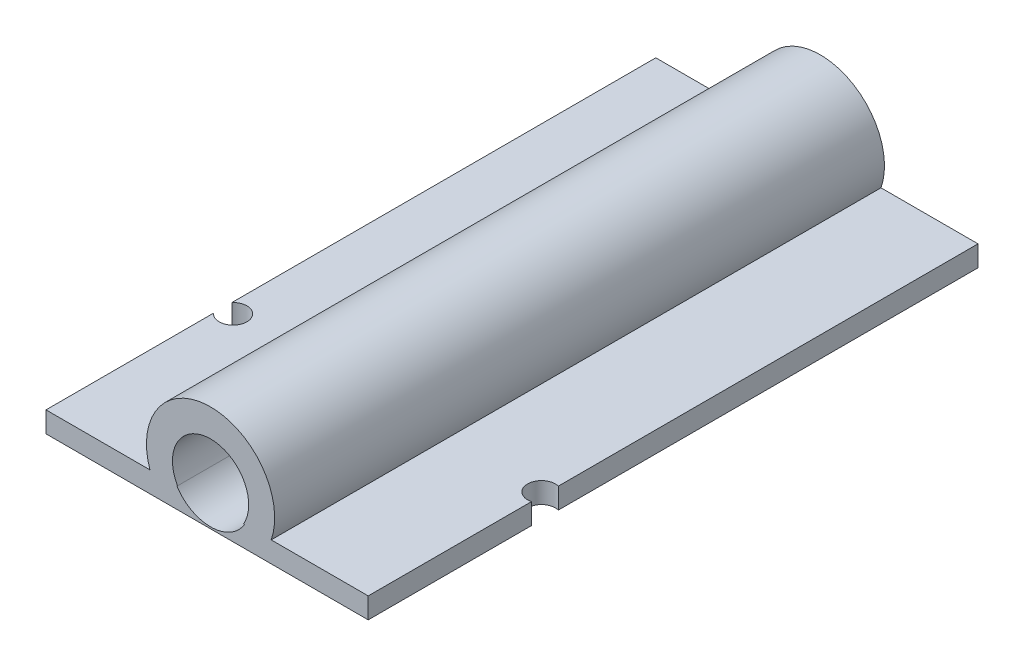
ISO-10303-21;
HEADER;
FILE_DESCRIPTION(('STEP AP214'),'2;1');
FILE_NAME('part.step','',(''),(''),'','','');
FILE_SCHEMA(('AUTOMOTIVE_DESIGN { 1 0 10303 214 1 1 1 1 }'));
ENDSEC;
DATA;
#1=APPLICATION_CONTEXT('core data for automotive mechanical design processes');
#2=APPLICATION_PROTOCOL_DEFINITION('international standard','automotive_design',2000,#1);
#3=PRODUCT_CONTEXT('',#1,'mechanical');
#4=PRODUCT('Part','Part','',(#3));
#5=PRODUCT_RELATED_PRODUCT_CATEGORY('part','',(#4));
#6=PRODUCT_DEFINITION_FORMATION('','',#4);
#7=PRODUCT_DEFINITION_CONTEXT('part definition',#1,'design');
#8=PRODUCT_DEFINITION('design','',#6,#7);
#9=PRODUCT_DEFINITION_SHAPE('','',#8);
#10=(LENGTH_UNIT() NAMED_UNIT(*) SI_UNIT(.MILLI.,.METRE.));
#11=(NAMED_UNIT(*) PLANE_ANGLE_UNIT() SI_UNIT($,.RADIAN.));
#12=(NAMED_UNIT(*) SI_UNIT($,.STERADIAN.) SOLID_ANGLE_UNIT());
#13=UNCERTAINTY_MEASURE_WITH_UNIT(LENGTH_MEASURE(1.E-05),#10,'distance_accuracy_value','');
#14=(GEOMETRIC_REPRESENTATION_CONTEXT(3) GLOBAL_UNCERTAINTY_ASSIGNED_CONTEXT((#13)) GLOBAL_UNIT_ASSIGNED_CONTEXT((#10,
#11,#12)) REPRESENTATION_CONTEXT('',''));
#15=CARTESIAN_POINT('',(0.,0.,0.));
#16=DIRECTION('',(0.,0.,1.));
#17=DIRECTION('',(1.,0.,0.));
#18=AXIS2_PLACEMENT_3D('',#15,#16,#17);
#19=CARTESIAN_POINT('',(1.5,54.4999999999999,78.));
#20=DIRECTION('',(0.,0.,1.));
#21=DIRECTION('',(1.,0.,0.));
#22=AXIS2_PLACEMENT_3D('',#19,#20,#21);
#23=PLANE('',#22);
#24=CARTESIAN_POINT('',(1.5,76.75,78.));
#25=DIRECTION('',(0.,0.,1.));
#26=DIRECTION('',(1.,0.,0.));
#27=AXIS2_PLACEMENT_3D('',#24,#25,#26);
#28=CIRCLE('',#27,5.75);
#29=CARTESIAN_POINT('',(4.33945417290011,71.75,78.));
#30=VERTEX_POINT('',#29);
#31=CARTESIAN_POINT('',(-1.33945417290011,71.75,78.));
#32=VERTEX_POINT('',#31);
#33=EDGE_CURVE('E217',#30,#32,#28,.F.);
#34=ORIENTED_EDGE('',*,*,#33,.T.);
#35=DIRECTION('',(-1.,0.,0.));
#36=VECTOR('',#35,1.);
#37=CARTESIAN_POINT('',(0.,71.75,78.));
#38=LINE('',#37,#36);
#39=EDGE_CURVE('E220',#30,#32,#38,.T.);
#40=ORIENTED_EDGE('',*,*,#39,.F.);
#41=EDGE_LOOP('',(#34,#40));
#42=FACE_BOUND('',#41,.T.);
#43=ADVANCED_FACE('F43',(#42),#23,.F.);
#44=CARTESIAN_POINT('',(-13.2226525126166,67.5,84.3375534189119));
#45=DIRECTION('',(0.,0.,-1.));
#46=DIRECTION('',(-1.,0.,0.));
#47=AXIS2_PLACEMENT_3D('',#44,#45,#46);
#48=PLANE('',#47);
#49=DIRECTION('',(1.,0.,0.));
#50=VECTOR('',#49,1.);
#51=CARTESIAN_POINT('',(-13.2226525126166,73.5,84.3375534189119));
#52=LINE('',#51,#50);
#53=CARTESIAN_POINT('',(9.08287544405156,73.5,84.3375534189119));
#54=VERTEX_POINT('',#53);
#55=CARTESIAN_POINT('',(16.7773474873834,73.5,84.3375534189119));
#56=VERTEX_POINT('',#55);
#57=EDGE_CURVE('E373',#54,#56,#52,.T.);
#58=ORIENTED_EDGE('',*,*,#57,.F.);
#59=CARTESIAN_POINT('',(1.5,76.75,84.3375534189119));
#60=DIRECTION('',(0.,0.,-1.));
#61=DIRECTION('',(-1.,0.,0.));
#62=AXIS2_PLACEMENT_3D('',#59,#60,#61);
#63=CIRCLE('',#62,8.25);
#64=CARTESIAN_POINT('',(7.16237582645305,70.75,84.3375534189119));
#65=VERTEX_POINT('',#64);
#66=EDGE_CURVE('E449',#54,#65,#63,.T.);
#67=ORIENTED_EDGE('',*,*,#66,.T.);
#68=DIRECTION('',(-1.,0.,0.));
#69=VECTOR('',#68,1.);
#70=CARTESIAN_POINT('',(-13.2226525126166,70.75,84.3375534189119));
#71=LINE('',#70,#69);
#72=CARTESIAN_POINT('',(16.7773474873834,70.75,84.3375534189119));
#73=VERTEX_POINT('',#72);
#74=EDGE_CURVE('E333',#73,#65,#71,.T.);
#75=ORIENTED_EDGE('',*,*,#74,.F.);
#76=DIRECTION('',(0.,1.,0.));
#77=VECTOR('',#76,1.);
#78=CARTESIAN_POINT('',(16.7773474873834,67.5,84.3375534189119));
#79=LINE('',#78,#77);
#80=EDGE_CURVE('E360',#73,#56,#79,.T.);
#81=ORIENTED_EDGE('',*,*,#80,.T.);
#82=EDGE_LOOP('',(#58,#67,#75,#81));
#83=FACE_BOUND('',#82,.T.);
#84=ADVANCED_FACE('F520',(#83),#48,.F.);
#85=CARTESIAN_POINT('',(1.5,76.75,123.));
#86=DIRECTION('',(0.,0.,-1.));
#87=DIRECTION('',(-1.,0.,0.));
#88=AXIS2_PLACEMENT_3D('',#85,#86,#87);
#89=CYLINDRICAL_SURFACE('',#88,5.75);
#90=CARTESIAN_POINT('',(1.5,76.75,35.));
#91=DIRECTION('',(0.,0.,-1.));
#92=DIRECTION('',(-1.,0.,0.));
#93=AXIS2_PLACEMENT_3D('',#90,#91,#92);
#94=CIRCLE('',#93,5.75);
#95=CARTESIAN_POINT('',(6.40535421758714,73.75,35.));
#96=VERTEX_POINT('',#95);
#97=CARTESIAN_POINT('',(-3.40535421758713,73.75,35.));
#98=VERTEX_POINT('',#97);
#99=EDGE_CURVE('E397',#96,#98,#94,.T.);
#100=ORIENTED_EDGE('',*,*,#99,.T.);
#101=DIRECTION('',(0.,0.,1.));
#102=VECTOR('',#101,1.);
#103=CARTESIAN_POINT('',(-3.40535421758713,73.75,20.5496539833816));
#104=LINE('',#103,#102);
#105=CARTESIAN_POINT('',(-3.40535421758713,73.75,123.));
#106=VERTEX_POINT('',#105);
#107=EDGE_CURVE('E274',#98,#106,#104,.T.);
#108=ORIENTED_EDGE('',*,*,#107,.T.);
#109=CARTESIAN_POINT('',(1.5,76.75,123.));
#110=DIRECTION('',(0.,0.,-1.));
#111=DIRECTION('',(-1.,0.,0.));
#112=AXIS2_PLACEMENT_3D('',#109,#110,#111);
#113=CIRCLE('',#112,5.75);
#114=CARTESIAN_POINT('',(6.40535421758714,73.75,123.));
#115=VERTEX_POINT('',#114);
#116=EDGE_CURVE('E398',#115,#106,#113,.T.);
#117=ORIENTED_EDGE('',*,*,#116,.F.);
#118=DIRECTION('',(0.,0.,1.));
#119=VECTOR('',#118,1.);
#120=CARTESIAN_POINT('',(6.40535421758714,73.75,20.5496539833816));
#121=LINE('',#120,#119);
#122=EDGE_CURVE('E256',#96,#115,#121,.T.);
#123=ORIENTED_EDGE('',*,*,#122,.F.);
#124=EDGE_LOOP('',(#100,#108,#117,#123));
#125=FACE_BOUND('',#124,.T.);
#126=DIRECTION('',(0.,0.,1.));
#127=VECTOR('',#126,1.);
#128=CARTESIAN_POINT('',(4.33945417290011,71.75,72.2717803813053));
#129=LINE('',#128,#127);
#130=CARTESIAN_POINT('',(4.33945417290011,71.75,81.8375534189119));
#131=VERTEX_POINT('',#130);
#132=EDGE_CURVE('E235',#30,#131,#129,.T.);
#133=ORIENTED_EDGE('',*,*,#132,.T.);
#134=CARTESIAN_POINT('',(1.5,76.75,81.8375534189119));
#135=DIRECTION('',(0.,0.,-1.));
#136=DIRECTION('',(-1.,0.,0.));
#137=AXIS2_PLACEMENT_3D('',#134,#135,#136);
#138=CIRCLE('',#137,5.75);
#139=CARTESIAN_POINT('',(6.24341649025258,73.5,81.8375534189119));
#140=VERTEX_POINT('',#139);
#141=EDGE_CURVE('E442',#131,#140,#138,.F.);
#142=ORIENTED_EDGE('',*,*,#141,.T.);
#143=DIRECTION('',(0.,0.,-1.));
#144=VECTOR('',#143,1.);
#145=CARTESIAN_POINT('',(6.24341649025258,73.5,123.));
#146=LINE('',#145,#144);
#147=CARTESIAN_POINT('',(6.24341649025258,73.5,110.662446581088));
#148=VERTEX_POINT('',#147);
#149=EDGE_CURVE('E413',#140,#148,#146,.F.);
#150=ORIENTED_EDGE('',*,*,#149,.T.);
#151=CARTESIAN_POINT('',(1.5,76.75,110.662446581088));
#152=DIRECTION('',(0.,0.,1.));
#153=DIRECTION('',(1.,0.,0.));
#154=AXIS2_PLACEMENT_3D('',#151,#152,#153);
#155=CIRCLE('',#154,5.75);
#156=CARTESIAN_POINT('',(-3.24341649025258,73.5,110.662446581088));
#157=VERTEX_POINT('',#156);
#158=EDGE_CURVE('E388',#148,#157,#155,.F.);
#159=ORIENTED_EDGE('',*,*,#158,.T.);
#160=DIRECTION('',(0.,0.,-1.));
#161=VECTOR('',#160,1.);
#162=CARTESIAN_POINT('',(-3.24341649025257,73.5,123.));
#163=LINE('',#162,#161);
#164=CARTESIAN_POINT('',(-3.24341649025257,73.5,81.8375534189119));
#165=VERTEX_POINT('',#164);
#166=EDGE_CURVE('E408',#157,#165,#163,.T.);
#167=ORIENTED_EDGE('',*,*,#166,.T.);
#168=CARTESIAN_POINT('',(1.5,76.75,81.8375534189119));
#169=DIRECTION('',(0.,0.,-1.));
#170=DIRECTION('',(-1.,0.,0.));
#171=AXIS2_PLACEMENT_3D('',#168,#169,#170);
#172=CIRCLE('',#171,5.75);
#173=CARTESIAN_POINT('',(-1.3394541729001,71.75,81.8375534189119));
#174=VERTEX_POINT('',#173);
#175=EDGE_CURVE('E231',#165,#174,#172,.F.);
#176=ORIENTED_EDGE('',*,*,#175,.T.);
#177=DIRECTION('',(0.,0.,1.));
#178=VECTOR('',#177,1.);
#179=CARTESIAN_POINT('',(-1.3394541729001,71.75,72.2717803813053));
#180=LINE('',#179,#178);
#181=EDGE_CURVE('E228',#32,#174,#180,.T.);
#182=ORIENTED_EDGE('',*,*,#181,.F.);
#183=ORIENTED_EDGE('',*,*,#33,.F.);
#184=EDGE_LOOP('',(#133,#142,#150,#159,#167,#176,#182,#183));
#185=FACE_BOUND('',#184,.T.);
#186=ADVANCED_FACE('F229',(#125,#185),#89,.F.);
#187=CARTESIAN_POINT('',(23.7516384681484,63.75,97.5000000000001));
#188=DIRECTION('',(0.,1.,0.));
#189=DIRECTION('',(-1.,0.,0.));
#190=AXIS2_PLACEMENT_3D('',#187,#188,#189);
#191=CYLINDRICAL_SURFACE('',#190,2.);
#192=CARTESIAN_POINT('',(23.7516384681484,73.75,97.5000000000001));
#193=DIRECTION('',(0.,1.,0.));
#194=DIRECTION('',(0.,0.,1.));
#195=AXIS2_PLACEMENT_3D('',#192,#193,#194);
#196=CIRCLE('',#195,2.);
#197=CARTESIAN_POINT('',(24.25,73.75,99.4369139845566));
#198=VERTEX_POINT('',#197);
#199=CARTESIAN_POINT('',(24.25,73.75,95.5630860154436));
#200=VERTEX_POINT('',#199);
#201=EDGE_CURVE('E427',#198,#200,#196,.F.);
#202=ORIENTED_EDGE('',*,*,#201,.F.);
#203=DIRECTION('',(0.,1.,0.));
#204=VECTOR('',#203,1.);
#205=CARTESIAN_POINT('',(24.25,63.75,99.4369139845566));
#206=LINE('',#205,#204);
#207=CARTESIAN_POINT('',(24.25,70.75,99.4369139845566));
#208=VERTEX_POINT('',#207);
#209=EDGE_CURVE('E420',#208,#198,#206,.T.);
#210=ORIENTED_EDGE('',*,*,#209,.F.);
#211=CARTESIAN_POINT('',(23.7516384681484,70.75,97.5000000000001));
#212=DIRECTION('',(0.,-1.,0.));
#213=DIRECTION('',(0.,0.,-1.));
#214=AXIS2_PLACEMENT_3D('',#211,#212,#213);
#215=CIRCLE('',#214,2.);
#216=CARTESIAN_POINT('',(24.25,70.75,95.5630860154436));
#217=VERTEX_POINT('',#216);
#218=EDGE_CURVE('E417',#217,#208,#215,.F.);
#219=ORIENTED_EDGE('',*,*,#218,.F.);
#220=DIRECTION('',(0.,1.,0.));
#221=VECTOR('',#220,1.);
#222=CARTESIAN_POINT('',(24.25,63.75,95.5630860154436));
#223=LINE('',#222,#221);
#224=EDGE_CURVE('E423',#200,#217,#223,.F.);
#225=ORIENTED_EDGE('',*,*,#224,.F.);
#226=EDGE_LOOP('',(#202,#210,#219,#225));
#227=FACE_BOUND('',#226,.T.);
#228=ADVANCED_FACE('F525',(#227),#191,.F.);
#229=CARTESIAN_POINT('',(-22.25,73.75,27.));
#230=DIRECTION('',(0.,1.,0.));
#231=DIRECTION('',(0.,0.,1.));
#232=AXIS2_PLACEMENT_3D('',#229,#230,#231);
#233=PLANE('',#232);
#234=DIRECTION('',(0.,0.,1.));
#235=VECTOR('',#234,1.);
#236=CARTESIAN_POINT('',(-22.25,73.75,27.));
#237=LINE('',#236,#235);
#238=CARTESIAN_POINT('',(-22.25,73.75,35.));
#239=VERTEX_POINT('',#238);
#240=CARTESIAN_POINT('',(-22.25,73.75,96.1771243444678));
#241=VERTEX_POINT('',#240);
#242=EDGE_CURVE('E303',#239,#241,#237,.T.);
#243=ORIENTED_EDGE('',*,*,#242,.T.);
#244=CARTESIAN_POINT('',(-20.75,73.75,97.5000000000001));
#245=DIRECTION('',(0.,1.,0.));
#246=DIRECTION('',(0.,0.,1.));
#247=AXIS2_PLACEMENT_3D('',#244,#245,#246);
#248=CIRCLE('',#247,2.);
#249=CARTESIAN_POINT('',(-22.25,73.75,98.8228756555324));
#250=VERTEX_POINT('',#249);
#251=EDGE_CURVE('E437',#241,#250,#248,.F.);
#252=ORIENTED_EDGE('',*,*,#251,.T.);
#253=CARTESIAN_POINT('',(-22.25,73.75,123.));
#254=VERTEX_POINT('',#253);
#255=EDGE_CURVE('E300',#250,#254,#237,.T.);
#256=ORIENTED_EDGE('',*,*,#255,.T.);
#257=DIRECTION('',(-1.,0.,0.));
#258=VECTOR('',#257,1.);
#259=CARTESIAN_POINT('',(-22.25,73.75,123.));
#260=LINE('',#259,#258);
#261=CARTESIAN_POINT('',(-7.25,73.75,123.));
#262=VERTEX_POINT('',#261);
#263=EDGE_CURVE('E295',#262,#254,#260,.T.);
#264=ORIENTED_EDGE('',*,*,#263,.F.);
#265=DIRECTION('',(0.,0.,1.));
#266=VECTOR('',#265,1.);
#267=CARTESIAN_POINT('',(-7.25,73.75,27.));
#268=LINE('',#267,#266);
#269=CARTESIAN_POINT('',(-7.25,73.75,35.));
#270=VERTEX_POINT('',#269);
#271=EDGE_CURVE('E304',#270,#262,#268,.T.);
#272=ORIENTED_EDGE('',*,*,#271,.F.);
#273=DIRECTION('',(1.,0.,0.));
#274=VECTOR('',#273,1.);
#275=CARTESIAN_POINT('',(1.5,73.75,35.));
#276=LINE('',#275,#274);
#277=EDGE_CURVE('E352',#239,#270,#276,.T.);
#278=ORIENTED_EDGE('',*,*,#277,.F.);
#279=EDGE_LOOP('',(#243,#252,#256,#264,#272,#278));
#280=FACE_BOUND('',#279,.T.);
#281=ADVANCED_FACE('F467',(#280),#233,.T.);
#282=CARTESIAN_POINT('',(-0.459936079835637,70.75,27.));
#283=DIRECTION('',(0.,-1.,0.));
#284=DIRECTION('',(0.,0.,-1.));
#285=AXIS2_PLACEMENT_3D('',#282,#283,#284);
#286=PLANE('',#285);
#287=ORIENTED_EDGE('',*,*,#74,.T.);
#288=CARTESIAN_POINT('',(7.16237582645305,70.75,84.3375534189119));
#289=CARTESIAN_POINT('',(6.98289855985499,70.75,84.3375186127797));
#290=CARTESIAN_POINT('',(6.80370107170493,70.75,84.3284560916239));
#291=CARTESIAN_POINT('',(6.44714606497945,70.75,84.2948681401664));
#292=CARTESIAN_POINT('',(6.2697852352038,70.75,84.2703787400899));
#293=CARTESIAN_POINT('',(5.744265055697,70.75,84.1781214138813));
#294=CARTESIAN_POINT('',(5.39944038145899,70.75,84.0914703843863));
#295=CARTESIAN_POINT('',(4.98162374743332,70.75,83.9652965905203));
#296=CARTESIAN_POINT('',(4.90353904481624,70.75,83.9407844761025));
#297=CARTESIAN_POINT('',(4.74768251136819,70.75,83.8902423008062));
#298=CARTESIAN_POINT('',(4.66991166656609,70.75,83.8642091943584));
#299=CARTESIAN_POINT('',(4.59232921921291,70.75,83.8375534189128));
#300=B_SPLINE_CURVE_WITH_KNOTS('',3,(#288,#289,#290,#291,#292,#293,#294,#295,#296,#297,#298,
#299),.UNSPECIFIED.,.F.,.F.,(4,2,2,2,2,4),(0.,0.537784484884843,1.07431758124694,
2.13780328221881,2.38334199381038,2.62939043584984),.UNSPECIFIED.);
#301=CARTESIAN_POINT('',(4.59232921921321,70.75,83.8375534189119));
#302=VERTEX_POINT('',#301);
#303=EDGE_CURVE('E67',#65,#302,#300,.T.);
#304=ORIENTED_EDGE('',*,*,#303,.T.);
#305=DIRECTION('',(-1.,0.,0.));
#306=VECTOR('',#305,1.);
#307=CARTESIAN_POINT('',(1.50000000000144,70.75,83.8375534189119));
#308=LINE('',#307,#306);
#309=CARTESIAN_POINT('',(-1.5923292192132,70.75,83.8375534189119));
#310=VERTEX_POINT('',#309);
#311=EDGE_CURVE('E71',#302,#310,#308,.T.);
#312=ORIENTED_EDGE('',*,*,#311,.T.);
#313=CARTESIAN_POINT('',(-1.5923292192132,70.75,83.8375534189119));
#314=CARTESIAN_POINT('',(-1.69607702180419,70.75,83.8732067099005));
#315=CARTESIAN_POINT('',(-1.80021278681783,70.75,83.9077497377434));
#316=CARTESIAN_POINT('',(-2.00939823470371,70.75,83.9740724211074));
#317=CARTESIAN_POINT('',(-2.11444822540615,70.75,84.0058511028448));
#318=CARTESIAN_POINT('',(-2.4295743689804,70.75,84.0957632244131));
#319=CARTESIAN_POINT('',(-2.64109179924058,70.75,84.1489925616779));
#320=CARTESIAN_POINT('',(-3.06881662966116,70.75,84.23818579736));
#321=CARTESIAN_POINT('',(-3.28503978190782,70.75,84.2740775396777));
#322=CARTESIAN_POINT('',(-3.72144312758634,70.75,84.3238093442575));
#323=CARTESIAN_POINT('',(-3.94164033265412,70.75,84.3374954846498));
#324=CARTESIAN_POINT('',(-4.16237582645304,70.75,84.3375534189119));
#325=B_SPLINE_CURVE_WITH_KNOTS('',3,(#313,#314,#315,#316,#317,#318,#319,#320,#321,#322,#323,
#324),.UNSPECIFIED.,.F.,.F.,(4,2,2,2,2,4),(0.,0.329107234882998,0.658329937347423,
1.31211895386211,1.96860597392301,2.62962439866315),.UNSPECIFIED.);
#326=CARTESIAN_POINT('',(-4.16237582645304,70.75,84.3375534189119));
#327=VERTEX_POINT('',#326);
#328=EDGE_CURVE('E452',#310,#327,#325,.T.);
#329=ORIENTED_EDGE('',*,*,#328,.T.);
#330=CARTESIAN_POINT('',(-13.2226525126166,70.75,84.3375534189119));
#331=VERTEX_POINT('',#330);
#332=EDGE_CURVE('E332',#327,#331,#71,.T.);
#333=ORIENTED_EDGE('',*,*,#332,.T.);
#334=DIRECTION('',(0.,0.,-1.));
#335=VECTOR('',#334,1.);
#336=CARTESIAN_POINT('',(-13.2226525126166,70.75,0.));
#337=LINE('',#336,#335);
#338=CARTESIAN_POINT('',(-13.2226525126166,70.75,110.662446581088));
#339=VERTEX_POINT('',#338);
#340=EDGE_CURVE('E336',#339,#331,#337,.T.);
#341=ORIENTED_EDGE('',*,*,#340,.F.);
#342=DIRECTION('',(1.,0.,0.));
#343=VECTOR('',#342,1.);
#344=CARTESIAN_POINT('',(-13.2226525126166,70.75,110.662446581088));
#345=LINE('',#344,#343);
#346=CARTESIAN_POINT('',(16.7773474873834,70.75,110.662446581088));
#347=VERTEX_POINT('',#346);
#348=EDGE_CURVE('E329',#339,#347,#345,.T.);
#349=ORIENTED_EDGE('',*,*,#348,.T.);
#350=DIRECTION('',(0.,0.,-1.));
#351=VECTOR('',#350,1.);
#352=CARTESIAN_POINT('',(16.7773474873834,70.75,0.));
#353=LINE('',#352,#351);
#354=EDGE_CURVE('E326',#347,#73,#353,.T.);
#355=ORIENTED_EDGE('',*,*,#354,.T.);
#356=EDGE_LOOP('',(#287,#304,#312,#329,#333,#341,#349,#355));
#357=FACE_BOUND('',#356,.T.);
#358=DIRECTION('',(0.,0.,1.));
#359=VECTOR('',#358,1.);
#360=CARTESIAN_POINT('',(24.25,70.75,27.));
#361=LINE('',#360,#359);
#362=CARTESIAN_POINT('',(24.25,70.75,35.));
#363=VERTEX_POINT('',#362);
#364=EDGE_CURVE('E316',#363,#217,#361,.T.);
#365=ORIENTED_EDGE('',*,*,#364,.T.);
#366=ORIENTED_EDGE('',*,*,#218,.T.);
#367=CARTESIAN_POINT('',(24.25,70.75,123.));
#368=VERTEX_POINT('',#367);
#369=EDGE_CURVE('E317',#208,#368,#361,.T.);
#370=ORIENTED_EDGE('',*,*,#369,.T.);
#371=DIRECTION('',(1.,0.,0.));
#372=VECTOR('',#371,1.);
#373=CARTESIAN_POINT('',(-0.459936079835637,70.75,123.));
#374=LINE('',#373,#372);
#375=CARTESIAN_POINT('',(-22.25,70.75,123.));
#376=VERTEX_POINT('',#375);
#377=EDGE_CURVE('E283',#376,#368,#374,.T.);
#378=ORIENTED_EDGE('',*,*,#377,.F.);
#379=DIRECTION('',(0.,0.,1.));
#380=VECTOR('',#379,1.);
#381=CARTESIAN_POINT('',(-22.25,70.75,27.));
#382=LINE('',#381,#380);
#383=CARTESIAN_POINT('',(-22.25,70.75,98.8228756555324));
#384=VERTEX_POINT('',#383);
#385=EDGE_CURVE('E299',#384,#376,#382,.T.);
#386=ORIENTED_EDGE('',*,*,#385,.F.);
#387=CARTESIAN_POINT('',(-20.75,70.75,97.5000000000001));
#388=DIRECTION('',(0.,-1.,0.));
#389=DIRECTION('',(0.,0.,-1.));
#390=AXIS2_PLACEMENT_3D('',#387,#388,#389);
#391=CIRCLE('',#390,2.);
#392=CARTESIAN_POINT('',(-22.25,70.75,96.1771243444678));
#393=VERTEX_POINT('',#392);
#394=EDGE_CURVE('E323',#384,#393,#391,.F.);
#395=ORIENTED_EDGE('',*,*,#394,.T.);
#396=CARTESIAN_POINT('',(-22.25,70.75,35.));
#397=VERTEX_POINT('',#396);
#398=EDGE_CURVE('E320',#397,#393,#382,.T.);
#399=ORIENTED_EDGE('',*,*,#398,.F.);
#400=DIRECTION('',(-1.,0.,0.));
#401=VECTOR('',#400,1.);
#402=CARTESIAN_POINT('',(1.5,70.75,35.));
#403=LINE('',#402,#401);
#404=EDGE_CURVE('E340',#363,#397,#403,.T.);
#405=ORIENTED_EDGE('',*,*,#404,.F.);
#406=EDGE_LOOP('',(#365,#366,#370,#378,#386,#395,#399,#405));
#407=FACE_BOUND('',#406,.T.);
#408=ADVANCED_FACE('F461',(#357,#407),#286,.T.);
#409=CARTESIAN_POINT('',(24.25,73.75,27.));
#410=DIRECTION('',(1.,0.,0.));
#411=DIRECTION('',(0.,0.,-1.));
#412=AXIS2_PLACEMENT_3D('',#409,#410,#411);
#413=PLANE('',#412);
#414=ORIENTED_EDGE('',*,*,#209,.T.);
#415=DIRECTION('',(0.,0.,1.));
#416=VECTOR('',#415,1.);
#417=CARTESIAN_POINT('',(24.25,73.75,27.));
#418=LINE('',#417,#416);
#419=CARTESIAN_POINT('',(24.25,73.75,123.));
#420=VERTEX_POINT('',#419);
#421=EDGE_CURVE('E313',#198,#420,#418,.T.);
#422=ORIENTED_EDGE('',*,*,#421,.T.);
#423=DIRECTION('',(0.,1.,0.));
#424=VECTOR('',#423,1.);
#425=CARTESIAN_POINT('',(24.25,73.75,123.));
#426=LINE('',#425,#424);
#427=EDGE_CURVE('E287',#368,#420,#426,.T.);
#428=ORIENTED_EDGE('',*,*,#427,.F.);
#429=ORIENTED_EDGE('',*,*,#369,.F.);
#430=EDGE_LOOP('',(#414,#422,#428,#429));
#431=FACE_BOUND('',#430,.T.);
#432=ADVANCED_FACE('F466',(#431),#413,.T.);
#433=CARTESIAN_POINT('',(24.25,73.75,35.));
#434=VERTEX_POINT('',#433);
#435=EDGE_CURVE('E312',#434,#200,#418,.T.);
#436=ORIENTED_EDGE('',*,*,#435,.T.);
#437=ORIENTED_EDGE('',*,*,#224,.T.);
#438=ORIENTED_EDGE('',*,*,#364,.F.);
#439=DIRECTION('',(0.,-1.,0.));
#440=VECTOR('',#439,1.);
#441=CARTESIAN_POINT('',(24.25,76.75,35.));
#442=LINE('',#441,#440);
#443=EDGE_CURVE('E344',#434,#363,#442,.T.);
#444=ORIENTED_EDGE('',*,*,#443,.F.);
#445=EDGE_LOOP('',(#436,#437,#438,#444));
#446=FACE_BOUND('',#445,.T.);
#447=ADVANCED_FACE('F468',(#446),#413,.T.);
#448=CARTESIAN_POINT('',(10.25,73.75,27.));
#449=DIRECTION('',(0.,1.,0.));
#450=DIRECTION('',(0.,0.,1.));
#451=AXIS2_PLACEMENT_3D('',#448,#449,#450);
#452=PLANE('',#451);
#453=DIRECTION('',(0.,0.,1.));
#454=VECTOR('',#453,1.);
#455=CARTESIAN_POINT('',(10.25,73.75,27.));
#456=LINE('',#455,#454);
#457=CARTESIAN_POINT('',(10.25,73.75,35.));
#458=VERTEX_POINT('',#457);
#459=CARTESIAN_POINT('',(10.25,73.75,123.));
#460=VERTEX_POINT('',#459);
#461=EDGE_CURVE('E308',#458,#460,#456,.T.);
#462=ORIENTED_EDGE('',*,*,#461,.T.);
#463=DIRECTION('',(-1.,0.,0.));
#464=VECTOR('',#463,1.);
#465=CARTESIAN_POINT('',(10.25,73.75,123.));
#466=LINE('',#465,#464);
#467=EDGE_CURVE('E291',#420,#460,#466,.T.);
#468=ORIENTED_EDGE('',*,*,#467,.F.);
#469=ORIENTED_EDGE('',*,*,#421,.F.);
#470=ORIENTED_EDGE('',*,*,#201,.T.);
#471=ORIENTED_EDGE('',*,*,#435,.F.);
#472=DIRECTION('',(1.,0.,0.));
#473=VECTOR('',#472,1.);
#474=CARTESIAN_POINT('',(1.5,73.75,35.));
#475=LINE('',#474,#473);
#476=EDGE_CURVE('E348',#458,#434,#475,.T.);
#477=ORIENTED_EDGE('',*,*,#476,.F.);
#478=EDGE_LOOP('',(#462,#468,#469,#470,#471,#477));
#479=FACE_BOUND('',#478,.T.);
#480=ADVANCED_FACE('F620',(#479),#452,.T.);
#481=CARTESIAN_POINT('',(-22.25,73.75,27.));
#482=DIRECTION('',(-1.,0.,0.));
#483=DIRECTION('',(0.,0.,1.));
#484=AXIS2_PLACEMENT_3D('',#481,#482,#483);
#485=PLANE('',#484);
#486=ORIENTED_EDGE('',*,*,#398,.T.);
#487=DIRECTION('',(0.,1.,0.));
#488=VECTOR('',#487,1.);
#489=CARTESIAN_POINT('',(-22.25,63.75,96.1771243444678));
#490=LINE('',#489,#488);
#491=EDGE_CURVE('E430',#393,#241,#490,.T.);
#492=ORIENTED_EDGE('',*,*,#491,.T.);
#493=ORIENTED_EDGE('',*,*,#242,.F.);
#494=DIRECTION('',(0.,1.,0.));
#495=VECTOR('',#494,1.);
#496=CARTESIAN_POINT('',(-22.25,76.75,35.));
#497=LINE('',#496,#495);
#498=EDGE_CURVE('E356',#397,#239,#497,.T.);
#499=ORIENTED_EDGE('',*,*,#498,.F.);
#500=EDGE_LOOP('',(#486,#492,#493,#499));
#501=FACE_BOUND('',#500,.T.);
#502=ADVANCED_FACE('F550',(#501),#485,.T.);
#503=DIRECTION('',(0.,1.,0.));
#504=VECTOR('',#503,1.);
#505=CARTESIAN_POINT('',(-22.25,63.75,98.8228756555324));
#506=LINE('',#505,#504);
#507=EDGE_CURVE('E433',#250,#384,#506,.F.);
#508=ORIENTED_EDGE('',*,*,#507,.T.);
#509=ORIENTED_EDGE('',*,*,#385,.T.);
#510=DIRECTION('',(0.,-1.,0.));
#511=VECTOR('',#510,1.);
#512=CARTESIAN_POINT('',(-22.25,73.75,123.));
#513=LINE('',#512,#511);
#514=EDGE_CURVE('E268',#254,#376,#513,.T.);
#515=ORIENTED_EDGE('',*,*,#514,.F.);
#516=ORIENTED_EDGE('',*,*,#255,.F.);
#517=EDGE_LOOP('',(#508,#509,#515,#516));
#518=FACE_BOUND('',#517,.T.);
#519=ADVANCED_FACE('F470',(#518),#485,.T.);
#520=CARTESIAN_POINT('',(-20.75,63.75,97.5000000000001));
#521=DIRECTION('',(0.,1.,0.));
#522=DIRECTION('',(-1.,0.,0.));
#523=AXIS2_PLACEMENT_3D('',#520,#521,#522);
#524=CYLINDRICAL_SURFACE('',#523,2.);
#525=ORIENTED_EDGE('',*,*,#251,.F.);
#526=ORIENTED_EDGE('',*,*,#491,.F.);
#527=ORIENTED_EDGE('',*,*,#394,.F.);
#528=ORIENTED_EDGE('',*,*,#507,.F.);
#529=EDGE_LOOP('',(#525,#526,#527,#528));
#530=FACE_BOUND('',#529,.T.);
#531=ADVANCED_FACE('F604',(#530),#524,.F.);
#532=CARTESIAN_POINT('',(-13.2226525126166,73.5,84.3375534189119));
#533=DIRECTION('',(0.,1.,0.));
#534=DIRECTION('',(-1.,0.,0.));
#535=AXIS2_PLACEMENT_3D('',#532,#533,#534);
#536=PLANE('',#535);
#537=DIRECTION('',(1.,0.,0.));
#538=VECTOR('',#537,1.);
#539=CARTESIAN_POINT('',(-13.2226525126166,73.5,110.662446581088));
#540=LINE('',#539,#538);
#541=CARTESIAN_POINT('',(-13.2226525126166,73.5,110.662446581088));
#542=VERTEX_POINT('',#541);
#543=EDGE_CURVE('E384',#542,#157,#540,.T.);
#544=ORIENTED_EDGE('',*,*,#543,.F.);
#545=DIRECTION('',(0.,0.,1.));
#546=VECTOR('',#545,1.);
#547=CARTESIAN_POINT('',(-13.2226525126166,73.5,84.3375534189119));
#548=LINE('',#547,#546);
#549=CARTESIAN_POINT('',(-13.2226525126166,73.5,84.3375534189119));
#550=VERTEX_POINT('',#549);
#551=EDGE_CURVE('E364',#550,#542,#548,.T.);
#552=ORIENTED_EDGE('',*,*,#551,.F.);
#553=CARTESIAN_POINT('',(-6.08287544405156,73.5,84.3375534189119));
#554=VERTEX_POINT('',#553);
#555=EDGE_CURVE('E390',#550,#554,#52,.T.);
#556=ORIENTED_EDGE('',*,*,#555,.T.);
#557=CARTESIAN_POINT('',(-6.08287544405156,73.5,84.3375534189119));
#558=CARTESIAN_POINT('',(-5.99742554756836,73.5,84.3375504838732));
#559=CARTESIAN_POINT('',(-5.91202453394893,73.5,84.3338508349287));
#560=CARTESIAN_POINT('',(-5.74186454998669,73.5,84.3191922135599));
#561=CARTESIAN_POINT('',(-5.65710544917436,73.5,84.30823475865));
#562=CARTESIAN_POINT('',(-5.40478106551531,73.5,84.2647136670926));
#563=CARTESIAN_POINT('',(-5.23893480411106,73.5,84.2215005487952));
#564=CARTESIAN_POINT('',(-4.91684943067995,73.5,84.1082300904009));
#565=CARTESIAN_POINT('',(-4.76060675330336,73.5,84.0381827832596));
#566=CARTESIAN_POINT('',(-4.46191062328037,73.5,83.8727847983944));
#567=CARTESIAN_POINT('',(-4.31946702589112,73.5,83.7774162155106));
#568=CARTESIAN_POINT('',(-4.05375520341774,73.5,83.5634036694455));
#569=CARTESIAN_POINT('',(-3.93044158683687,73.5,83.4448163617698));
#570=CARTESIAN_POINT('',(-3.70852615483995,73.5,83.1864105670415));
#571=CARTESIAN_POINT('',(-3.60988202004039,73.5,83.0466291087381));
#572=CARTESIAN_POINT('',(-3.4664418037588,73.5,82.7895238939682));
#573=CARTESIAN_POINT('',(-3.41429860133599,73.5,82.676272580789));
#574=CARTESIAN_POINT('',(-3.32967739665787,73.5,82.4427584778387));
#575=CARTESIAN_POINT('',(-3.29715301252998,73.5,82.3225129679133));
#576=CARTESIAN_POINT('',(-3.26484987803749,73.5,82.1405803910749));
#577=CARTESIAN_POINT('',(-3.25683020514275,73.5,82.0802666530402));
#578=CARTESIAN_POINT('',(-3.24610972447704,73.5,81.9591646748948));
#579=CARTESIAN_POINT('',(-3.24340931122089,73.5,81.8983763999245));
#580=CARTESIAN_POINT('',(-3.24341649025258,73.5,81.8375534189119));
#581=B_SPLINE_CURVE_WITH_KNOTS('',3,(#557,#558,#559,#560,#561,#562,#563,#564,#565,#566,#567,
#568,#569,#570,#571,#572,#573,#574,#575,#576,#577,#578,#579,#580),.UNSPECIFIED.,.F.,.F.,(4,2,2,
2,2,2,2,2,2,2,2,4),(0.,0.256177473936389,0.512301401344636,1.02385655523999,1.53522063166851,
2.04694727094306,2.55744047807554,3.06705185556343,3.43958899078487,3.81124190395843,
3.99357081551717,4.17591324939894),.UNSPECIFIED.);
#582=EDGE_CURVE('E11',#554,#165,#581,.T.);
#583=ORIENTED_EDGE('',*,*,#582,.T.);
#584=ORIENTED_EDGE('',*,*,#166,.F.);
#585=EDGE_LOOP('',(#544,#552,#556,#583,#584));
#586=FACE_BOUND('',#585,.T.);
#587=ADVANCED_FACE('F510',(#586),#536,.F.);
#588=ORIENTED_EDGE('',*,*,#149,.F.);
#589=CARTESIAN_POINT('',(6.24341649025258,73.5,81.8375534189119));
#590=CARTESIAN_POINT('',(6.24339808557512,73.5,81.9002393591639));
#591=CARTESIAN_POINT('',(6.24627396532454,73.5,81.9629154999142));
#592=CARTESIAN_POINT('',(6.25767262834511,73.5,82.0877157801896));
#593=CARTESIAN_POINT('',(6.26619203527922,73.5,82.1498402272682));
#594=CARTESIAN_POINT('',(6.28866690796402,73.5,82.2727009674816));
#595=CARTESIAN_POINT('',(6.30258853818318,73.5,82.3334434572314));
#596=CARTESIAN_POINT('',(6.33561086678771,73.5,82.4534918590889));
#597=CARTESIAN_POINT('',(6.35471211269002,73.5,82.5127976186032));
#598=CARTESIAN_POINT('',(6.41925441825731,73.5,82.6877171916461));
#599=CARTESIAN_POINT('',(6.47200515036506,73.5,82.8007082477453));
#600=CARTESIAN_POINT('',(6.59425432805782,73.5,83.0172751776547));
#601=CARTESIAN_POINT('',(6.66377854653352,73.5,83.1208362214064));
#602=CARTESIAN_POINT('',(6.82333163707106,73.5,83.3253610592607));
#603=CARTESIAN_POINT('',(6.91460157691258,73.5,83.4253547303514));
#604=CARTESIAN_POINT('',(7.1105009966905,73.5,83.6111906764392));
#605=CARTESIAN_POINT('',(7.2151345894106,73.5,83.6970285761585));
#606=CARTESIAN_POINT('',(7.45278337183223,73.5,83.8661909987746));
#607=CARTESIAN_POINT('',(7.58765969966311,73.5,83.946908339604));
#608=CARTESIAN_POINT('',(7.86819306557347,73.5,84.0867260060581));
#609=CARTESIAN_POINT('',(8.01385372698041,73.5,84.1458190263384));
#610=CARTESIAN_POINT('',(8.31157976937014,73.5,84.2408166831234));
#611=CARTESIAN_POINT('',(8.46360026754318,73.5,84.2768616507574));
#612=CARTESIAN_POINT('',(8.77134042879511,73.5,84.3252505792091));
#613=CARTESIAN_POINT('',(8.92705976517311,73.5,84.337596625418));
#614=CARTESIAN_POINT('',(9.08287544405156,73.5,84.3375534189119));
#615=B_SPLINE_CURVE_WITH_KNOTS('',3,(#589,#590,#591,#592,#593,#594,#595,#596,#597,#598,#599,
#600,#601,#602,#603,#604,#605,#606,#607,#608,#609,#610,#611,#612,#613,#614),.UNSPECIFIED.,.F.,
.F.,(4,2,2,2,2,2,2,2,2,2,2,2,4),(0.,0.187975810777608,0.375839263242892,0.562544590755729,
0.749269661858337,1.12158956300129,1.49448522799463,1.89909784355913,2.30383528369548,
2.77343312263752,3.24318945968015,3.7100576816811,4.17688481963881),.UNSPECIFIED.);
#616=EDGE_CURVE('E59',#140,#54,#615,.T.);
#617=ORIENTED_EDGE('',*,*,#616,.T.);
#618=ORIENTED_EDGE('',*,*,#57,.T.);
#619=DIRECTION('',(0.,0.,1.));
#620=VECTOR('',#619,1.);
#621=CARTESIAN_POINT('',(16.7773474873834,73.5,84.3375534189119));
#622=LINE('',#621,#620);
#623=CARTESIAN_POINT('',(16.7773474873834,73.5,110.662446581088));
#624=VERTEX_POINT('',#623);
#625=EDGE_CURVE('E377',#56,#624,#622,.T.);
#626=ORIENTED_EDGE('',*,*,#625,.T.);
#627=EDGE_CURVE('E389',#148,#624,#540,.T.);
#628=ORIENTED_EDGE('',*,*,#627,.F.);
#629=EDGE_LOOP('',(#588,#617,#618,#626,#628));
#630=FACE_BOUND('',#629,.T.);
#631=ADVANCED_FACE('F504',(#630),#536,.F.);
#632=CARTESIAN_POINT('',(1.5,76.75,123.));
#633=DIRECTION('',(0.,0.,-1.));
#634=DIRECTION('',(-1.,0.,0.));
#635=AXIS2_PLACEMENT_3D('',#632,#633,#634);
#636=CYLINDRICAL_SURFACE('',#635,9.25);
#637=CARTESIAN_POINT('',(1.5,76.75,35.));
#638=DIRECTION('',(0.,0.,-1.));
#639=DIRECTION('',(-1.,0.,0.));
#640=AXIS2_PLACEMENT_3D('',#637,#638,#639);
#641=CIRCLE('',#640,9.25);
#642=EDGE_CURVE('E402',#270,#458,#641,.T.);
#643=ORIENTED_EDGE('',*,*,#642,.F.);
#644=ORIENTED_EDGE('',*,*,#271,.T.);
#645=CARTESIAN_POINT('',(1.5,76.75,123.));
#646=DIRECTION('',(0.,0.,-1.));
#647=DIRECTION('',(-1.,0.,0.));
#648=AXIS2_PLACEMENT_3D('',#645,#646,#647);
#649=CIRCLE('',#648,9.25);
#650=EDGE_CURVE('E405',#262,#460,#649,.T.);
#651=ORIENTED_EDGE('',*,*,#650,.T.);
#652=ORIENTED_EDGE('',*,*,#461,.F.);
#653=EDGE_LOOP('',(#643,#644,#651,#652));
#654=FACE_BOUND('',#653,.T.);
#655=ADVANCED_FACE('F509',(#654),#636,.T.);
#656=CARTESIAN_POINT('',(1.5,76.75,123.));
#657=DIRECTION('',(0.,0.,-1.));
#658=DIRECTION('',(-1.,0.,0.));
#659=AXIS2_PLACEMENT_3D('',#656,#657,#658);
#660=PLANE('',#659);
#661=ORIENTED_EDGE('',*,*,#116,.T.);
#662=DIRECTION('',(1.,0.,0.));
#663=VECTOR('',#662,1.);
#664=CARTESIAN_POINT('',(0.,73.75,123.));
#665=LINE('',#664,#663);
#666=CARTESIAN_POINT('',(-3.2631397208144,73.75,123.));
#667=VERTEX_POINT('',#666);
#668=EDGE_CURVE('E247',#106,#667,#665,.T.);
#669=ORIENTED_EDGE('',*,*,#668,.T.);
#670=CARTESIAN_POINT('',(1.5,76.5,123.));
#671=DIRECTION('',(0.,0.,1.));
#672=DIRECTION('',(1.,0.,0.));
#673=AXIS2_PLACEMENT_3D('',#670,#671,#672);
#674=CIRCLE('',#673,5.5);
#675=CARTESIAN_POINT('',(6.26313972081441,73.75,123.));
#676=VERTEX_POINT('',#675);
#677=EDGE_CURVE('E243',#676,#667,#674,.T.);
#678=ORIENTED_EDGE('',*,*,#677,.F.);
#679=DIRECTION('',(-1.,0.,0.));
#680=VECTOR('',#679,1.);
#681=CARTESIAN_POINT('',(0.,73.75,123.));
#682=LINE('',#681,#680);
#683=EDGE_CURVE('E252',#115,#676,#682,.T.);
#684=ORIENTED_EDGE('',*,*,#683,.F.);
#685=EDGE_LOOP('',(#661,#669,#678,#684));
#686=FACE_BOUND('',#685,.T.);
#687=ORIENTED_EDGE('',*,*,#650,.F.);
#688=ORIENTED_EDGE('',*,*,#263,.T.);
#689=ORIENTED_EDGE('',*,*,#514,.T.);
#690=ORIENTED_EDGE('',*,*,#377,.T.);
#691=ORIENTED_EDGE('',*,*,#427,.T.);
#692=ORIENTED_EDGE('',*,*,#467,.T.);
#693=EDGE_LOOP('',(#687,#688,#689,#690,#691,#692));
#694=FACE_BOUND('',#693,.T.);
#695=ADVANCED_FACE('F527',(#686,#694),#660,.F.);
#696=CARTESIAN_POINT('',(1.5,76.75,35.));
#697=DIRECTION('',(0.,0.,-1.));
#698=DIRECTION('',(-1.,0.,0.));
#699=AXIS2_PLACEMENT_3D('',#696,#697,#698);
#700=PLANE('',#699);
#701=ORIENTED_EDGE('',*,*,#99,.F.);
#702=DIRECTION('',(-1.,0.,0.));
#703=VECTOR('',#702,1.);
#704=CARTESIAN_POINT('',(0.,73.75,35.));
#705=LINE('',#704,#703);
#706=CARTESIAN_POINT('',(6.26313972081441,73.75,35.));
#707=VERTEX_POINT('',#706);
#708=EDGE_CURVE('E251',#96,#707,#705,.T.);
#709=ORIENTED_EDGE('',*,*,#708,.T.);
#710=CARTESIAN_POINT('',(1.5,76.5,35.));
#711=DIRECTION('',(0.,0.,-1.));
#712=DIRECTION('',(-1.,0.,0.));
#713=AXIS2_PLACEMENT_3D('',#710,#711,#712);
#714=CIRCLE('',#713,5.5);
#715=CARTESIAN_POINT('',(-3.2631397208144,73.75,35.));
#716=VERTEX_POINT('',#715);
#717=EDGE_CURVE('E264',#707,#716,#714,.F.);
#718=ORIENTED_EDGE('',*,*,#717,.T.);
#719=DIRECTION('',(1.,0.,0.));
#720=VECTOR('',#719,1.);
#721=CARTESIAN_POINT('',(0.,73.75,35.));
#722=LINE('',#721,#720);
#723=EDGE_CURVE('E260',#98,#716,#722,.T.);
#724=ORIENTED_EDGE('',*,*,#723,.F.);
#725=EDGE_LOOP('',(#701,#709,#718,#724));
#726=FACE_BOUND('',#725,.T.);
#727=ORIENTED_EDGE('',*,*,#277,.T.);
#728=ORIENTED_EDGE('',*,*,#642,.T.);
#729=ORIENTED_EDGE('',*,*,#476,.T.);
#730=ORIENTED_EDGE('',*,*,#443,.T.);
#731=ORIENTED_EDGE('',*,*,#404,.T.);
#732=ORIENTED_EDGE('',*,*,#498,.T.);
#733=EDGE_LOOP('',(#727,#728,#729,#730,#731,#732));
#734=FACE_BOUND('',#733,.T.);
#735=ADVANCED_FACE('F530',(#726,#734),#700,.T.);
#736=CARTESIAN_POINT('',(16.7773474873834,0.,0.));
#737=DIRECTION('',(1.,0.,0.));
#738=DIRECTION('',(0.,0.,-1.));
#739=AXIS2_PLACEMENT_3D('',#736,#737,#738);
#740=PLANE('',#739);
#741=ORIENTED_EDGE('',*,*,#354,.F.);
#742=DIRECTION('',(0.,-1.,0.));
#743=VECTOR('',#742,1.);
#744=CARTESIAN_POINT('',(16.7773474873834,67.5,110.662446581088));
#745=LINE('',#744,#743);
#746=EDGE_CURVE('E365',#624,#347,#745,.T.);
#747=ORIENTED_EDGE('',*,*,#746,.F.);
#748=ORIENTED_EDGE('',*,*,#625,.F.);
#749=ORIENTED_EDGE('',*,*,#80,.F.);
#750=EDGE_LOOP('',(#741,#747,#748,#749));
#751=FACE_BOUND('',#750,.T.);
#752=ADVANCED_FACE('F533',(#751),#740,.F.);
#753=CARTESIAN_POINT('',(-13.2226525126166,0.,0.));
#754=DIRECTION('',(1.,0.,0.));
#755=DIRECTION('',(0.,0.,-1.));
#756=AXIS2_PLACEMENT_3D('',#753,#754,#755);
#757=PLANE('',#756);
#758=DIRECTION('',(0.,-1.,0.));
#759=VECTOR('',#758,1.);
#760=CARTESIAN_POINT('',(-13.2226525126166,67.5,110.662446581088));
#761=LINE('',#760,#759);
#762=EDGE_CURVE('E369',#542,#339,#761,.T.);
#763=ORIENTED_EDGE('',*,*,#762,.T.);
#764=ORIENTED_EDGE('',*,*,#340,.T.);
#765=DIRECTION('',(0.,1.,0.));
#766=VECTOR('',#765,1.);
#767=CARTESIAN_POINT('',(-13.2226525126166,67.5,84.3375534189119));
#768=LINE('',#767,#766);
#769=EDGE_CURVE('E361',#331,#550,#768,.T.);
#770=ORIENTED_EDGE('',*,*,#769,.T.);
#771=ORIENTED_EDGE('',*,*,#551,.T.);
#772=EDGE_LOOP('',(#763,#764,#770,#771));
#773=FACE_BOUND('',#772,.T.);
#774=ADVANCED_FACE('F596',(#773),#757,.T.);
#775=CARTESIAN_POINT('',(-13.2226525126166,67.5,110.662446581088));
#776=DIRECTION('',(0.,0.,1.));
#777=DIRECTION('',(1.,0.,0.));
#778=AXIS2_PLACEMENT_3D('',#775,#776,#777);
#779=PLANE('',#778);
#780=ORIENTED_EDGE('',*,*,#348,.F.);
#781=ORIENTED_EDGE('',*,*,#762,.F.);
#782=ORIENTED_EDGE('',*,*,#543,.T.);
#783=ORIENTED_EDGE('',*,*,#158,.F.);
#784=ORIENTED_EDGE('',*,*,#627,.T.);
#785=ORIENTED_EDGE('',*,*,#746,.T.);
#786=EDGE_LOOP('',(#780,#781,#782,#783,#784,#785));
#787=FACE_BOUND('',#786,.T.);
#788=ADVANCED_FACE('F512',(#787),#779,.F.);
#789=ORIENTED_EDGE('',*,*,#332,.F.);
#790=CARTESIAN_POINT('',(1.5,76.75,84.3375534189119));
#791=DIRECTION('',(0.,0.,-1.));
#792=DIRECTION('',(-1.,0.,0.));
#793=AXIS2_PLACEMENT_3D('',#790,#791,#792);
#794=CIRCLE('',#793,8.25);
#795=EDGE_CURVE('E446',#327,#554,#794,.T.);
#796=ORIENTED_EDGE('',*,*,#795,.T.);
#797=ORIENTED_EDGE('',*,*,#555,.F.);
#798=ORIENTED_EDGE('',*,*,#769,.F.);
#799=EDGE_LOOP('',(#789,#796,#797,#798));
#800=FACE_BOUND('',#799,.T.);
#801=ADVANCED_FACE('F514',(#800),#48,.F.);
#802=CARTESIAN_POINT('',(1.5,76.5,20.5496539833816));
#803=DIRECTION('',(0.,0.,1.));
#804=DIRECTION('',(1.,0.,0.));
#805=AXIS2_PLACEMENT_3D('',#802,#803,#804);
#806=CYLINDRICAL_SURFACE('',#805,5.5);
#807=ORIENTED_EDGE('',*,*,#717,.F.);
#808=DIRECTION('',(0.,0.,1.));
#809=VECTOR('',#808,1.);
#810=CARTESIAN_POINT('',(6.26313972081441,73.75,20.5496539833816));
#811=LINE('',#810,#809);
#812=EDGE_CURVE('E239',#707,#676,#811,.T.);
#813=ORIENTED_EDGE('',*,*,#812,.T.);
#814=ORIENTED_EDGE('',*,*,#677,.T.);
#815=DIRECTION('',(0.,0.,1.));
#816=VECTOR('',#815,1.);
#817=CARTESIAN_POINT('',(-3.2631397208144,73.75,20.5496539833816));
#818=LINE('',#817,#816);
#819=EDGE_CURVE('E263',#716,#667,#818,.T.);
#820=ORIENTED_EDGE('',*,*,#819,.F.);
#821=EDGE_LOOP('',(#807,#813,#814,#820));
#822=FACE_BOUND('',#821,.T.);
#823=ADVANCED_FACE('F518',(#822),#806,.F.);
#824=CARTESIAN_POINT('',(0.,73.75,20.5496539833816));
#825=DIRECTION('',(0.,-1.,0.));
#826=DIRECTION('',(0.,0.,-1.));
#827=AXIS2_PLACEMENT_3D('',#824,#825,#826);
#828=PLANE('',#827);
#829=ORIENTED_EDGE('',*,*,#107,.F.);
#830=ORIENTED_EDGE('',*,*,#723,.T.);
#831=ORIENTED_EDGE('',*,*,#819,.T.);
#832=ORIENTED_EDGE('',*,*,#668,.F.);
#833=EDGE_LOOP('',(#829,#830,#831,#832));
#834=FACE_BOUND('',#833,.T.);
#835=ADVANCED_FACE('F646',(#834),#828,.T.);
#836=CARTESIAN_POINT('',(0.,73.75,20.5496539833816));
#837=DIRECTION('',(0.,1.,0.));
#838=DIRECTION('',(0.,0.,1.));
#839=AXIS2_PLACEMENT_3D('',#836,#837,#838);
#840=PLANE('',#839);
#841=ORIENTED_EDGE('',*,*,#708,.F.);
#842=ORIENTED_EDGE('',*,*,#122,.T.);
#843=ORIENTED_EDGE('',*,*,#683,.T.);
#844=ORIENTED_EDGE('',*,*,#812,.F.);
#845=EDGE_LOOP('',(#841,#842,#843,#844));
#846=FACE_BOUND('',#845,.T.);
#847=ADVANCED_FACE('F650',(#846),#840,.F.);
#848=CARTESIAN_POINT('',(0.,71.75,72.2717803813053));
#849=DIRECTION('',(0.,-1.,0.));
#850=DIRECTION('',(0.,0.,-1.));
#851=AXIS2_PLACEMENT_3D('',#848,#849,#850);
#852=PLANE('',#851);
#853=ORIENTED_EDGE('',*,*,#181,.T.);
#854=DIRECTION('',(-1.,0.,0.));
#855=VECTOR('',#854,1.);
#856=CARTESIAN_POINT('',(0.,71.75,81.8375534189119));
#857=LINE('',#856,#855);
#858=EDGE_CURVE('E479',#174,#131,#857,.F.);
#859=ORIENTED_EDGE('',*,*,#858,.T.);
#860=ORIENTED_EDGE('',*,*,#132,.F.);
#861=ORIENTED_EDGE('',*,*,#39,.T.);
#862=EDGE_LOOP('',(#853,#859,#860,#861));
#863=FACE_BOUND('',#862,.T.);
#864=ADVANCED_FACE('F237',(#863),#852,.F.);
#865=CARTESIAN_POINT('',(1.5,76.75,81.8375534189119));
#866=DIRECTION('',(0.,0.,-1.));
#867=DIRECTION('',(-1.,0.,0.));
#868=AXIS2_PLACEMENT_3D('',#865,#866,#867);
#869=TOROIDAL_SURFACE('',#868,8.25,2.5);
#870=ORIENTED_EDGE('',*,*,#795,.F.);
#871=ORIENTED_EDGE('',*,*,#328,.F.);
#872=CARTESIAN_POINT('',(-1.93693177121684,69.25,79.3375534189119));
#873=CARTESIAN_POINT('',(-1.9358307919245,69.2550453503127,79.3375533494922));
#874=CARTESIAN_POINT('',(-1.93472922426026,69.2600909412675,79.3375686272003));
#875=CARTESIAN_POINT('',(-1.90231382086277,69.4084933439498,79.3384690860764));
#876=CARTESIAN_POINT('',(-1.87054347859738,69.5519608987767,79.3517201034736));
#877=CARTESIAN_POINT('',(-1.80701363822687,69.8347827574176,79.4026463349878));
#878=CARTESIAN_POINT('',(-1.77525442882887,69.9741241796607,79.4403910182892));
#879=CARTESIAN_POINT('',(-1.71277030283065,70.2443875148591,79.5393225879222));
#880=CARTESIAN_POINT('',(-1.68204459479352,70.3753159436653,79.6004910706398));
#881=CARTESIAN_POINT('',(-1.62265297370979,70.6249469128719,79.7446405187392));
#882=CARTESIAN_POINT('',(-1.59398557616454,70.7436582918072,79.827605558607));
#883=CARTESIAN_POINT('',(-1.53995387815577,70.9646039731895,80.0125235274414));
#884=CARTESIAN_POINT('',(-1.51456716255048,71.0669513644542,80.1143346115282));
#885=CARTESIAN_POINT('',(-1.467914011827,71.2530216358421,80.3346590427856));
#886=CARTESIAN_POINT('',(-1.4466487905918,71.3367390300386,80.4531772929343));
#887=CARTESIAN_POINT('',(-1.40971913470835,71.4809125848101,80.7004426087719));
#888=CARTESIAN_POINT('',(-1.3939307530264,71.5418862602462,80.8288697117248));
#889=CARTESIAN_POINT('',(-1.36806699917042,71.6412410410376,81.0945753866426));
#890=CARTESIAN_POINT('',(-1.35798219609753,71.6796594456878,81.2318389263382));
#891=CARTESIAN_POINT('',(-1.34717887397568,71.7207237350786,81.4481324714917));
#892=CARTESIAN_POINT('',(-1.34428768575641,71.7316875845127,81.5255685460358));
#893=CARTESIAN_POINT('',(-1.34042464179688,71.7463276669816,81.681175018346));
#894=CARTESIAN_POINT('',(-1.33945276660165,71.750003973886,81.7593454086606));
#895=CARTESIAN_POINT('',(-1.33945663926803,71.7499930305938,81.9747147217667));
#896=CARTESIAN_POINT('',(-1.34245274303241,71.7386661847949,82.1119917367257));
#897=CARTESIAN_POINT('',(-1.35429120182654,71.6937032919718,82.382707347802));
#898=CARTESIAN_POINT('',(-1.36314163688863,71.6600364114704,82.5161403725307));
#899=CARTESIAN_POINT('',(-1.38622261505351,71.5715671559127,82.7751124160663));
#900=CARTESIAN_POINT('',(-1.40044600047492,71.5167928975206,82.9006616790105));
#901=CARTESIAN_POINT('',(-1.43359154389103,71.3878757464185,83.1406434038164));
#902=CARTESIAN_POINT('',(-1.45251266565881,71.3137371249135,83.2550783095496));
#903=CARTESIAN_POINT('',(-1.4945750983,71.1469786063869,83.471706039245));
#904=CARTESIAN_POINT('',(-1.5177793645721,71.0540807575978,83.5736724782718));
#905=CARTESIAN_POINT('',(-1.56728285125993,70.8532585191079,83.7606745889469));
#906=CARTESIAN_POINT('',(-1.59358291351084,70.7453300406828,83.8457056383796));
#907=CARTESIAN_POINT('',(-1.64916684407172,70.5140286609439,83.9990482421401));
#908=CARTESIAN_POINT('',(-1.67851629429578,70.3902912333595,84.0667857367697));
#909=CARTESIAN_POINT('',(-1.7385443864093,70.1334861743539,84.1804458825267));
#910=CARTESIAN_POINT('',(-1.7692225999506,70.0004215412788,84.2263755074911));
#911=CARTESIAN_POINT('',(-1.82236245702305,69.7666044712601,84.2856880826119));
#912=CARTESIAN_POINT('',(-1.84473134161136,69.6671814309447,84.3045741322659));
#913=CARTESIAN_POINT('',(-1.88934810924647,69.4668765544304,84.3301668225974));
#914=CARTESIAN_POINT('',(-1.91159614028383,69.3659977908857,84.3368961531032));
#915=CARTESIAN_POINT('',(-1.93472920131266,69.2600910339508,84.3375381824584));
#916=CARTESIAN_POINT('',(-1.93583076900991,69.2550454424686,84.3375534598051));
#917=CARTESIAN_POINT('',(-1.93693177121684,69.25,84.3375534189119));
#918=B_SPLINE_CURVE_WITH_KNOTS('',3,(#872,#873,#874,#875,#876,#877,#878,#879,#880,#881,#882,
#883,#884,#885,#886,#887,#888,#889,#890,#891,#892,#893,#894,#895,#896,#897,#898,#899,#900,#901,
#902,#903,#904,#905,#906,#907,#908,#909,#910,#911,#912,#913,#914,#915,#916,#917),.UNSPECIFIED.,
.F.,.F.,(4,2,2,2,2,2,2,2,2,2,2,2,2,2,2,2,2,2,2,2,2,2,4),(0.,0.015493281819055,0.455680548570946,
0.897121767899938,1.33821686487376,1.77899057054509,2.21657255641846,2.65428322591483,
3.08131871384779,3.50764601619657,3.74210544058123,3.97656248837318,4.38775354201735,
4.7995133008826,5.21072644933646,5.6218489728327,6.03958088086574,6.45742664567612,
6.88773011649774,7.31789588974493,7.62818284187917,7.93789006027526,7.95338334209432),.UNSPECIFIED.);
#919=EDGE_CURVE('E48',#174,#310,#918,.T.);
#920=ORIENTED_EDGE('',*,*,#919,.F.);
#921=ORIENTED_EDGE('',*,*,#175,.F.);
#922=ORIENTED_EDGE('',*,*,#582,.F.);
#923=EDGE_LOOP('',(#870,#871,#920,#921,#922));
#924=FACE_BOUND('',#923,.T.);
#925=ADVANCED_FACE('F45',(#924),#869,.T.);
#926=CARTESIAN_POINT('',(-13.2226525126166,69.25,81.8375534189119));
#927=DIRECTION('',(-1.,0.,0.));
#928=DIRECTION('',(0.,0.,1.));
#929=AXIS2_PLACEMENT_3D('',#926,#927,#928);
#930=CYLINDRICAL_SURFACE('',#929,2.5);
#931=ORIENTED_EDGE('',*,*,#919,.T.);
#932=ORIENTED_EDGE('',*,*,#311,.F.);
#933=CARTESIAN_POINT('',(4.93693177121684,69.25,79.3375534189119));
#934=CARTESIAN_POINT('',(4.9358307919245,69.2550453503127,79.3375533494922));
#935=CARTESIAN_POINT('',(4.93472922426026,69.2600909412675,79.3375686272003));
#936=CARTESIAN_POINT('',(4.90231382086275,69.4084933439498,79.3384690860764));
#937=CARTESIAN_POINT('',(4.87054347859737,69.5519608987767,79.3517201034736));
#938=CARTESIAN_POINT('',(4.80701363822687,69.8347827574176,79.4026463349878));
#939=CARTESIAN_POINT('',(4.77525442882888,69.9741241796607,79.4403910182892));
#940=CARTESIAN_POINT('',(4.71277030283066,70.2443875148591,79.5393225879222));
#941=CARTESIAN_POINT('',(4.68204459479352,70.3753159436653,79.6004910706398));
#942=CARTESIAN_POINT('',(4.62265297370979,70.6249469128719,79.7446405187392));
#943=CARTESIAN_POINT('',(4.59398557616455,70.7436582918072,79.827605558607));
#944=CARTESIAN_POINT('',(4.53995387815578,70.9646039731895,80.0125235274414));
#945=CARTESIAN_POINT('',(4.51456716255049,71.0669513644542,80.1143346115282));
#946=CARTESIAN_POINT('',(4.467914011827,71.2530216358421,80.3346590427856));
#947=CARTESIAN_POINT('',(4.4466487905918,71.3367390300386,80.4531772929343));
#948=CARTESIAN_POINT('',(4.40971913470835,71.4809125848101,80.7004426087719));
#949=CARTESIAN_POINT('',(4.39393075302641,71.5418862602462,80.8288697117248));
#950=CARTESIAN_POINT('',(4.36806699917043,71.6412410410376,81.0945753866426));
#951=CARTESIAN_POINT('',(4.35798219609753,71.6796594456878,81.2318389263382));
#952=CARTESIAN_POINT('',(4.34717887397568,71.7207237350786,81.4481324714917));
#953=CARTESIAN_POINT('',(4.34428768575641,71.7316875845127,81.5255685460358));
#954=CARTESIAN_POINT('',(4.34042464179688,71.7463276669816,81.681175018346));
#955=CARTESIAN_POINT('',(4.33945276660165,71.750003973886,81.7593454086606));
#956=CARTESIAN_POINT('',(4.33945663926803,71.7499930305938,81.9747147217667));
#957=CARTESIAN_POINT('',(4.34245274303242,71.7386661847949,82.1119917367257));
#958=CARTESIAN_POINT('',(4.35429120182655,71.6937032919718,82.382707347802));
#959=CARTESIAN_POINT('',(4.36314163688863,71.6600364114704,82.5161403725307));
#960=CARTESIAN_POINT('',(4.38622261505351,71.5715671559127,82.7751124160663));
#961=CARTESIAN_POINT('',(4.40044600047492,71.5167928975206,82.9006616790105));
#962=CARTESIAN_POINT('',(4.43359154389104,71.3878757464185,83.1406434038164));
#963=CARTESIAN_POINT('',(4.45251266565881,71.3137371249135,83.2550783095496));
#964=CARTESIAN_POINT('',(4.49457509830001,71.1469786063869,83.471706039245));
#965=CARTESIAN_POINT('',(4.5177793645721,71.0540807575978,83.5736724782718));
#966=CARTESIAN_POINT('',(4.56728285125994,70.8532585191079,83.7606745889469));
#967=CARTESIAN_POINT('',(4.59358291351085,70.7453300406828,83.8457056383796));
#968=CARTESIAN_POINT('',(4.64916684407173,70.5140286609439,83.9990482421401));
#969=CARTESIAN_POINT('',(4.67851629429579,70.3902912333595,84.0667857367697));
#970=CARTESIAN_POINT('',(4.73854438640931,70.1334861743539,84.1804458825267));
#971=CARTESIAN_POINT('',(4.7692225999506,70.0004215412788,84.2263755074911));
#972=CARTESIAN_POINT('',(4.82236245702305,69.7666044712601,84.2856880826119));
#973=CARTESIAN_POINT('',(4.84473134161136,69.6671814309447,84.3045741322659));
#974=CARTESIAN_POINT('',(4.88934810924647,69.4668765544304,84.3301668225974));
#975=CARTESIAN_POINT('',(4.91159614028383,69.3659977908857,84.3368961531032));
#976=CARTESIAN_POINT('',(4.93472920131266,69.2600910339508,84.3375381824584));
#977=CARTESIAN_POINT('',(4.93583076900991,69.2550454424686,84.3375534598051));
#978=CARTESIAN_POINT('',(4.93693177121684,69.25,84.3375534189119));
#979=B_SPLINE_CURVE_WITH_KNOTS('',3,(#933,#934,#935,#936,#937,#938,#939,#940,#941,#942,#943,
#944,#945,#946,#947,#948,#949,#950,#951,#952,#953,#954,#955,#956,#957,#958,#959,#960,#961,#962,
#963,#964,#965,#966,#967,#968,#969,#970,#971,#972,#973,#974,#975,#976,#977,#978),.UNSPECIFIED.,
.F.,.F.,(4,2,2,2,2,2,2,2,2,2,2,2,2,2,2,2,2,2,2,2,2,2,4),(0.,0.0154932818190553,
0.455680548570947,0.897121767899938,1.33821686487375,1.77899057054507,2.21657255641846,
2.65428322591483,3.08131871384779,3.50764601619657,3.74210544058122,3.97656248837318,
4.38775354201735,4.79951330088259,5.21072644933646,5.62184897283269,6.03958088086574,
6.45742664567612,6.88773011649774,7.31789588974493,7.62818284187917,7.93789006027524,
7.95338334209431),.UNSPECIFIED.);
#980=EDGE_CURVE('E225',#131,#302,#979,.T.);
#981=ORIENTED_EDGE('',*,*,#980,.F.);
#982=ORIENTED_EDGE('',*,*,#858,.F.);
#983=EDGE_LOOP('',(#931,#932,#981,#982));
#984=FACE_BOUND('',#983,.T.);
#985=ADVANCED_FACE('F484',(#984),#930,.T.);
#986=CARTESIAN_POINT('',(1.5,76.75,81.8375534189119));
#987=DIRECTION('',(0.,0.,-1.));
#988=DIRECTION('',(-1.,0.,0.));
#989=AXIS2_PLACEMENT_3D('',#986,#987,#988);
#990=TOROIDAL_SURFACE('',#989,8.25,2.5);
#991=ORIENTED_EDGE('',*,*,#303,.F.);
#992=ORIENTED_EDGE('',*,*,#66,.F.);
#993=ORIENTED_EDGE('',*,*,#616,.F.);
#994=ORIENTED_EDGE('',*,*,#141,.F.);
#995=ORIENTED_EDGE('',*,*,#980,.T.);
#996=EDGE_LOOP('',(#991,#992,#993,#994,#995));
#997=FACE_BOUND('',#996,.T.);
#998=ADVANCED_FACE('F481',(#997),#990,.T.);
#999=CLOSED_SHELL('',(#43,#84,#186,#228,#281,#408,#432,#447,#480,#502,#519,#531,#587,#631,#655,
#695,#735,#752,#774,#788,#801,#823,#835,#847,#864,#925,#985,#998));
#1000=MANIFOLD_SOLID_BREP('B2',#999);
#1001=ADVANCED_BREP_SHAPE_REPRESENTATION('',(#18,#1000),#14);
#1002=SHAPE_DEFINITION_REPRESENTATION(#9,#1001);
ENDSEC;
END-ISO-10303-21;
